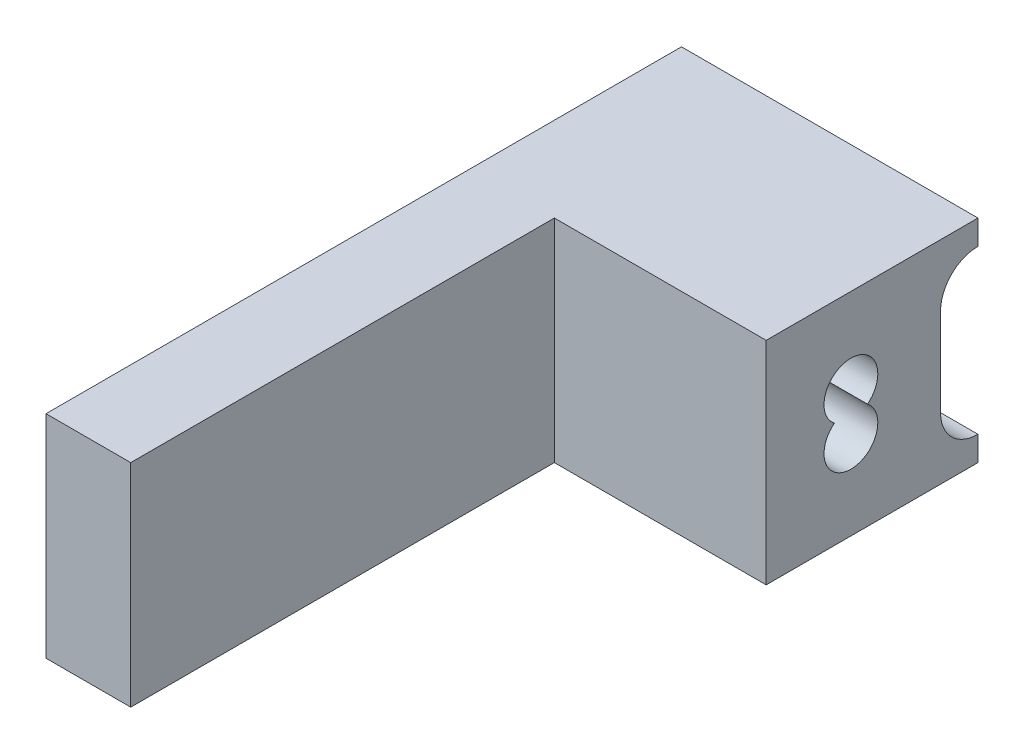
ISO-10303-21;
HEADER;
FILE_DESCRIPTION(('STEP AP214'),'2;1');
FILE_NAME('part.step','',(''),(''),'','','');
FILE_SCHEMA(('AUTOMOTIVE_DESIGN { 1 0 10303 214 1 1 1 1 }'));
ENDSEC;
DATA;
#1=APPLICATION_CONTEXT('core data for automotive mechanical design processes');
#2=APPLICATION_PROTOCOL_DEFINITION('international standard','automotive_design',2000,#1);
#3=PRODUCT_CONTEXT('',#1,'mechanical');
#4=PRODUCT('Part','Part','',(#3));
#5=PRODUCT_RELATED_PRODUCT_CATEGORY('part','',(#4));
#6=PRODUCT_DEFINITION_FORMATION('','',#4);
#7=PRODUCT_DEFINITION_CONTEXT('part definition',#1,'design');
#8=PRODUCT_DEFINITION('design','',#6,#7);
#9=PRODUCT_DEFINITION_SHAPE('','',#8);
#10=(LENGTH_UNIT() NAMED_UNIT(*) SI_UNIT(.MILLI.,.METRE.));
#11=(NAMED_UNIT(*) PLANE_ANGLE_UNIT() SI_UNIT($,.RADIAN.));
#12=(NAMED_UNIT(*) SI_UNIT($,.STERADIAN.) SOLID_ANGLE_UNIT());
#13=UNCERTAINTY_MEASURE_WITH_UNIT(LENGTH_MEASURE(1.E-05),#10,'distance_accuracy_value','');
#14=(GEOMETRIC_REPRESENTATION_CONTEXT(3) GLOBAL_UNCERTAINTY_ASSIGNED_CONTEXT((#13)) GLOBAL_UNIT_ASSIGNED_CONTEXT((#10,
#11,#12)) REPRESENTATION_CONTEXT('',''));
#15=CARTESIAN_POINT('',(0.,0.,0.));
#16=DIRECTION('',(0.,0.,1.));
#17=DIRECTION('',(1.,0.,0.));
#18=AXIS2_PLACEMENT_3D('',#15,#16,#17);
#19=CARTESIAN_POINT('',(-125.,25.,-175.));
#20=DIRECTION('',(0.,0.,1.));
#21=DIRECTION('',(-1.,0.,0.));
#22=AXIS2_PLACEMENT_3D('',#19,#20,#21);
#23=PLANE('',#22);
#24=DIRECTION('',(0.,-1.,0.));
#25=VECTOR('',#24,1.);
#26=CARTESIAN_POINT('',(-125.,25.,-175.));
#27=LINE('',#26,#25);
#28=CARTESIAN_POINT('',(-125.,25.,-175.));
#29=VERTEX_POINT('',#28);
#30=CARTESIAN_POINT('',(-125.,22.1062124204509,-175.));
#31=VERTEX_POINT('',#30);
#32=EDGE_CURVE('E201',#29,#31,#27,.T.);
#33=ORIENTED_EDGE('',*,*,#32,.T.);
#34=DIRECTION('',(1.,0.,0.));
#35=VECTOR('',#34,1.);
#36=CARTESIAN_POINT('',(-160.,22.1062124204509,-175.));
#37=LINE('',#36,#35);
#38=CARTESIAN_POINT('',(-160.,22.1062124204509,-175.));
#39=VERTEX_POINT('',#38);
#40=EDGE_CURVE('E152',#31,#39,#37,.F.);
#41=ORIENTED_EDGE('',*,*,#40,.T.);
#42=DIRECTION('',(0.,-1.,0.));
#43=VECTOR('',#42,1.);
#44=CARTESIAN_POINT('',(-160.,25.,-175.));
#45=LINE('',#44,#43);
#46=CARTESIAN_POINT('',(-160.,25.,-175.));
#47=VERTEX_POINT('',#46);
#48=EDGE_CURVE('E140',#47,#39,#45,.T.);
#49=ORIENTED_EDGE('',*,*,#48,.F.);
#50=DIRECTION('',(1.,0.,0.));
#51=VECTOR('',#50,1.);
#52=CARTESIAN_POINT('',(-125.,25.,-175.));
#53=LINE('',#52,#51);
#54=EDGE_CURVE('E177',#47,#29,#53,.T.);
#55=ORIENTED_EDGE('',*,*,#54,.T.);
#56=EDGE_LOOP('',(#33,#41,#49,#55));
#57=FACE_BOUND('',#56,.T.);
#58=ADVANCED_FACE('F32',(#57),#23,.F.);
#59=CARTESIAN_POINT('',(-150.,25.,-150.));
#60=DIRECTION('',(0.,0.,-1.));
#61=DIRECTION('',(1.,0.,0.));
#62=AXIS2_PLACEMENT_3D('',#59,#60,#61);
#63=PLANE('',#62);
#64=DIRECTION('',(-1.,0.,0.));
#65=VECTOR('',#64,1.);
#66=CARTESIAN_POINT('',(-150.,0.,-150.));
#67=LINE('',#66,#65);
#68=CARTESIAN_POINT('',(-125.,0.,-150.));
#69=VERTEX_POINT('',#68);
#70=CARTESIAN_POINT('',(-150.,0.,-150.));
#71=VERTEX_POINT('',#70);
#72=EDGE_CURVE('E164',#69,#71,#67,.T.);
#73=ORIENTED_EDGE('',*,*,#72,.F.);
#74=DIRECTION('',(0.,-1.,0.));
#75=VECTOR('',#74,1.);
#76=CARTESIAN_POINT('',(-125.,25.,-150.));
#77=LINE('',#76,#75);
#78=CARTESIAN_POINT('',(-125.,25.,-150.));
#79=VERTEX_POINT('',#78);
#80=EDGE_CURVE('E182',#79,#69,#77,.T.);
#81=ORIENTED_EDGE('',*,*,#80,.F.);
#82=DIRECTION('',(-1.,0.,0.));
#83=VECTOR('',#82,1.);
#84=CARTESIAN_POINT('',(-150.,25.,-150.));
#85=LINE('',#84,#83);
#86=CARTESIAN_POINT('',(-150.,25.,-150.));
#87=VERTEX_POINT('',#86);
#88=EDGE_CURVE('E165',#79,#87,#85,.T.);
#89=ORIENTED_EDGE('',*,*,#88,.T.);
#90=DIRECTION('',(0.,-1.,0.));
#91=VECTOR('',#90,1.);
#92=CARTESIAN_POINT('',(-150.,25.,-150.));
#93=LINE('',#92,#91);
#94=EDGE_CURVE('E212',#87,#71,#93,.T.);
#95=ORIENTED_EDGE('',*,*,#94,.T.);
#96=EDGE_LOOP('',(#73,#81,#89,#95));
#97=FACE_BOUND('',#96,.T.);
#98=ADVANCED_FACE('F34',(#97),#63,.F.);
#99=CARTESIAN_POINT('',(-150.,25.,-100.));
#100=DIRECTION('',(-1.,0.,0.));
#101=DIRECTION('',(0.,0.,-1.));
#102=AXIS2_PLACEMENT_3D('',#99,#100,#101);
#103=PLANE('',#102);
#104=DIRECTION('',(0.,0.,1.));
#105=VECTOR('',#104,1.);
#106=CARTESIAN_POINT('',(-150.,0.,-100.));
#107=LINE('',#106,#105);
#108=CARTESIAN_POINT('',(-150.,0.,-100.));
#109=VERTEX_POINT('',#108);
#110=EDGE_CURVE('E185',#71,#109,#107,.T.);
#111=ORIENTED_EDGE('',*,*,#110,.F.);
#112=ORIENTED_EDGE('',*,*,#94,.F.);
#113=DIRECTION('',(0.,0.,1.));
#114=VECTOR('',#113,1.);
#115=CARTESIAN_POINT('',(-150.,25.,-100.));
#116=LINE('',#115,#114);
#117=CARTESIAN_POINT('',(-150.,25.,-100.));
#118=VERTEX_POINT('',#117);
#119=EDGE_CURVE('E168',#87,#118,#116,.T.);
#120=ORIENTED_EDGE('',*,*,#119,.T.);
#121=DIRECTION('',(0.,-1.,0.));
#122=VECTOR('',#121,1.);
#123=CARTESIAN_POINT('',(-150.,25.,-100.));
#124=LINE('',#123,#122);
#125=EDGE_CURVE('E209',#118,#109,#124,.T.);
#126=ORIENTED_EDGE('',*,*,#125,.T.);
#127=EDGE_LOOP('',(#111,#112,#120,#126));
#128=FACE_BOUND('',#127,.T.);
#129=ADVANCED_FACE('F247',(#128),#103,.F.);
#130=CARTESIAN_POINT('',(-160.,25.,-100.));
#131=DIRECTION('',(0.,0.,-1.));
#132=DIRECTION('',(1.,0.,0.));
#133=AXIS2_PLACEMENT_3D('',#130,#131,#132);
#134=PLANE('',#133);
#135=DIRECTION('',(-1.,0.,0.));
#136=VECTOR('',#135,1.);
#137=CARTESIAN_POINT('',(-160.,0.,-100.));
#138=LINE('',#137,#136);
#139=CARTESIAN_POINT('',(-160.,0.,-100.));
#140=VERTEX_POINT('',#139);
#141=EDGE_CURVE('E188',#109,#140,#138,.T.);
#142=ORIENTED_EDGE('',*,*,#141,.F.);
#143=ORIENTED_EDGE('',*,*,#125,.F.);
#144=DIRECTION('',(-1.,0.,0.));
#145=VECTOR('',#144,1.);
#146=CARTESIAN_POINT('',(-160.,25.,-100.));
#147=LINE('',#146,#145);
#148=CARTESIAN_POINT('',(-160.,25.,-100.));
#149=VERTEX_POINT('',#148);
#150=EDGE_CURVE('E172',#118,#149,#147,.T.);
#151=ORIENTED_EDGE('',*,*,#150,.T.);
#152=DIRECTION('',(0.,-1.,0.));
#153=VECTOR('',#152,1.);
#154=CARTESIAN_POINT('',(-160.,25.,-100.));
#155=LINE('',#154,#153);
#156=EDGE_CURVE('E206',#149,#140,#155,.T.);
#157=ORIENTED_EDGE('',*,*,#156,.T.);
#158=EDGE_LOOP('',(#142,#143,#151,#157));
#159=FACE_BOUND('',#158,.T.);
#160=ADVANCED_FACE('F241',(#159),#134,.F.);
#161=CARTESIAN_POINT('',(-160.,25.,-175.));
#162=DIRECTION('',(1.,0.,0.));
#163=DIRECTION('',(0.,0.,1.));
#164=AXIS2_PLACEMENT_3D('',#161,#162,#163);
#165=PLANE('',#164);
#166=ORIENTED_EDGE('',*,*,#48,.T.);
#167=CARTESIAN_POINT('',(-160.,17.6853007015382,-175.));
#168=DIRECTION('',(1.,0.,0.));
#169=DIRECTION('',(0.,0.,-1.));
#170=AXIS2_PLACEMENT_3D('',#167,#168,#169);
#171=CIRCLE('',#170,4.42091171891271);
#172=CARTESIAN_POINT('',(-160.,17.6853007015382,-170.579088281087));
#173=VERTEX_POINT('',#172);
#174=EDGE_CURVE('E122',#39,#173,#171,.T.);
#175=ORIENTED_EDGE('',*,*,#174,.T.);
#176=DIRECTION('',(0.,-1.,0.));
#177=VECTOR('',#176,1.);
#178=CARTESIAN_POINT('',(-160.,17.6853007015382,-170.579088281087));
#179=LINE('',#178,#177);
#180=CARTESIAN_POINT('',(-160.,7.31469929846185,-170.579088281087));
#181=VERTEX_POINT('',#180);
#182=EDGE_CURVE('E129',#173,#181,#179,.T.);
#183=ORIENTED_EDGE('',*,*,#182,.T.);
#184=CARTESIAN_POINT('',(-160.,7.31469929846185,-175.));
#185=DIRECTION('',(1.,0.,0.));
#186=DIRECTION('',(0.,0.,-1.));
#187=AXIS2_PLACEMENT_3D('',#184,#185,#186);
#188=CIRCLE('',#187,4.42091171891271);
#189=CARTESIAN_POINT('',(-160.,2.89378757954914,-175.));
#190=VERTEX_POINT('',#189);
#191=EDGE_CURVE('E126',#181,#190,#188,.T.);
#192=ORIENTED_EDGE('',*,*,#191,.T.);
#193=CARTESIAN_POINT('',(-160.,0.,-175.));
#194=VERTEX_POINT('',#193);
#195=EDGE_CURVE('E204',#190,#194,#45,.T.);
#196=ORIENTED_EDGE('',*,*,#195,.T.);
#197=DIRECTION('',(0.,0.,-1.));
#198=VECTOR('',#197,1.);
#199=CARTESIAN_POINT('',(-160.,0.,-175.));
#200=LINE('',#199,#198);
#201=EDGE_CURVE('E191',#140,#194,#200,.T.);
#202=ORIENTED_EDGE('',*,*,#201,.F.);
#203=ORIENTED_EDGE('',*,*,#156,.F.);
#204=DIRECTION('',(0.,0.,-1.));
#205=VECTOR('',#204,1.);
#206=CARTESIAN_POINT('',(-160.,25.,-175.));
#207=LINE('',#206,#205);
#208=EDGE_CURVE('E175',#149,#47,#207,.T.);
#209=ORIENTED_EDGE('',*,*,#208,.T.);
#210=EDGE_LOOP('',(#166,#175,#183,#192,#196,#202,#203,#209));
#211=FACE_BOUND('',#210,.T.);
#212=CARTESIAN_POINT('',(-160.,15.,-160.000000000001));
#213=DIRECTION('',(1.,0.,0.));
#214=DIRECTION('',(0.,0.,-1.));
#215=AXIS2_PLACEMENT_3D('',#212,#213,#214);
#216=CIRCLE('',#215,3.175);
#217=CARTESIAN_POINT('',(-160.,12.5,-161.957198252606));
#218=VERTEX_POINT('',#217);
#219=CARTESIAN_POINT('',(-160.,12.5,-158.042801747396));
#220=VERTEX_POINT('',#219);
#221=EDGE_CURVE('E157',#218,#220,#216,.T.);
#222=ORIENTED_EDGE('',*,*,#221,.T.);
#223=CARTESIAN_POINT('',(-160.,10.,-160.000000000001));
#224=DIRECTION('',(1.,0.,0.));
#225=DIRECTION('',(0.,0.,1.));
#226=AXIS2_PLACEMENT_3D('',#223,#224,#225);
#227=CIRCLE('',#226,3.175);
#228=EDGE_CURVE('E154',#220,#218,#227,.T.);
#229=ORIENTED_EDGE('',*,*,#228,.T.);
#230=EDGE_LOOP('',(#222,#229));
#231=FACE_BOUND('',#230,.T.);
#232=ADVANCED_FACE('F136',(#211,#231),#165,.F.);
#233=ORIENTED_EDGE('',*,*,#195,.F.);
#234=DIRECTION('',(1.,0.,0.));
#235=VECTOR('',#234,1.);
#236=CARTESIAN_POINT('',(-160.,2.89378757954914,-175.));
#237=LINE('',#236,#235);
#238=CARTESIAN_POINT('',(-125.,2.89378757954914,-175.));
#239=VERTEX_POINT('',#238);
#240=EDGE_CURVE('E148',#190,#239,#237,.T.);
#241=ORIENTED_EDGE('',*,*,#240,.T.);
#242=CARTESIAN_POINT('',(-125.,0.,-175.));
#243=VERTEX_POINT('',#242);
#244=EDGE_CURVE('E200',#239,#243,#27,.T.);
#245=ORIENTED_EDGE('',*,*,#244,.T.);
#246=DIRECTION('',(1.,0.,0.));
#247=VECTOR('',#246,1.);
#248=CARTESIAN_POINT('',(-125.,0.,-175.));
#249=LINE('',#248,#247);
#250=EDGE_CURVE('E194',#194,#243,#249,.T.);
#251=ORIENTED_EDGE('',*,*,#250,.F.);
#252=EDGE_LOOP('',(#233,#241,#245,#251));
#253=FACE_BOUND('',#252,.T.);
#254=ADVANCED_FACE('F227',(#253),#23,.F.);
#255=CARTESIAN_POINT('',(-125.,25.,-150.));
#256=DIRECTION('',(-1.,0.,0.));
#257=DIRECTION('',(0.,0.,-1.));
#258=AXIS2_PLACEMENT_3D('',#255,#256,#257);
#259=PLANE('',#258);
#260=CARTESIAN_POINT('',(-125.,15.,-160.000000000001));
#261=DIRECTION('',(1.,0.,0.));
#262=DIRECTION('',(0.,0.,-1.));
#263=AXIS2_PLACEMENT_3D('',#260,#261,#262);
#264=CIRCLE('',#263,3.175);
#265=CARTESIAN_POINT('',(-125.,12.5,-161.957198252606));
#266=VERTEX_POINT('',#265);
#267=CARTESIAN_POINT('',(-125.,12.5,-158.042801747396));
#268=VERTEX_POINT('',#267);
#269=EDGE_CURVE('E161',#266,#268,#264,.T.);
#270=ORIENTED_EDGE('',*,*,#269,.F.);
#271=CARTESIAN_POINT('',(-125.,10.,-160.000000000001));
#272=DIRECTION('',(1.,0.,0.));
#273=DIRECTION('',(0.,0.,1.));
#274=AXIS2_PLACEMENT_3D('',#271,#272,#273);
#275=CIRCLE('',#274,3.175);
#276=EDGE_CURVE('E55',#268,#266,#275,.T.);
#277=ORIENTED_EDGE('',*,*,#276,.F.);
#278=EDGE_LOOP('',(#270,#277));
#279=FACE_BOUND('',#278,.T.);
#280=DIRECTION('',(0.,-1.,0.));
#281=VECTOR('',#280,1.);
#282=CARTESIAN_POINT('',(-125.,17.6853007015382,-170.579088281087));
#283=LINE('',#282,#281);
#284=CARTESIAN_POINT('',(-125.,17.6853007015382,-170.579088281087));
#285=VERTEX_POINT('',#284);
#286=CARTESIAN_POINT('',(-125.,7.31469929846185,-170.579088281087));
#287=VERTEX_POINT('',#286);
#288=EDGE_CURVE('E143',#285,#287,#283,.T.);
#289=ORIENTED_EDGE('',*,*,#288,.F.);
#290=CARTESIAN_POINT('',(-125.,17.6853007015382,-175.));
#291=DIRECTION('',(-1.,0.,0.));
#292=DIRECTION('',(0.,0.,1.));
#293=AXIS2_PLACEMENT_3D('',#290,#291,#292);
#294=CIRCLE('',#293,4.42091171891271);
#295=EDGE_CURVE('E11',#285,#31,#294,.T.);
#296=ORIENTED_EDGE('',*,*,#295,.T.);
#297=ORIENTED_EDGE('',*,*,#32,.F.);
#298=DIRECTION('',(0.,0.,1.));
#299=VECTOR('',#298,1.);
#300=CARTESIAN_POINT('',(-125.,25.,-150.));
#301=LINE('',#300,#299);
#302=EDGE_CURVE('E180',#29,#79,#301,.T.);
#303=ORIENTED_EDGE('',*,*,#302,.T.);
#304=ORIENTED_EDGE('',*,*,#80,.T.);
#305=DIRECTION('',(0.,0.,1.));
#306=VECTOR('',#305,1.);
#307=CARTESIAN_POINT('',(-125.,0.,-150.));
#308=LINE('',#307,#306);
#309=EDGE_CURVE('E169',#243,#69,#308,.T.);
#310=ORIENTED_EDGE('',*,*,#309,.F.);
#311=ORIENTED_EDGE('',*,*,#244,.F.);
#312=CARTESIAN_POINT('',(-125.,7.31469929846185,-175.));
#313=DIRECTION('',(1.,0.,0.));
#314=DIRECTION('',(0.,0.,-1.));
#315=AXIS2_PLACEMENT_3D('',#312,#313,#314);
#316=CIRCLE('',#315,4.42091171891271);
#317=EDGE_CURVE('E141',#287,#239,#316,.T.);
#318=ORIENTED_EDGE('',*,*,#317,.F.);
#319=EDGE_LOOP('',(#289,#296,#297,#303,#304,#310,#311,#318));
#320=FACE_BOUND('',#319,.T.);
#321=ADVANCED_FACE('F223',(#279,#320),#259,.F.);
#322=CARTESIAN_POINT('',(0.,25.,0.));
#323=DIRECTION('',(0.,-1.,0.));
#324=DIRECTION('',(0.,0.,-1.));
#325=AXIS2_PLACEMENT_3D('',#322,#323,#324);
#326=PLANE('',#325);
#327=ORIENTED_EDGE('',*,*,#88,.F.);
#328=ORIENTED_EDGE('',*,*,#302,.F.);
#329=ORIENTED_EDGE('',*,*,#54,.F.);
#330=ORIENTED_EDGE('',*,*,#208,.F.);
#331=ORIENTED_EDGE('',*,*,#150,.F.);
#332=ORIENTED_EDGE('',*,*,#119,.F.);
#333=EDGE_LOOP('',(#327,#328,#329,#330,#331,#332));
#334=FACE_BOUND('',#333,.T.);
#335=ADVANCED_FACE('F226',(#334),#326,.F.);
#336=CARTESIAN_POINT('',(0.,0.,0.));
#337=DIRECTION('',(0.,-1.,0.));
#338=DIRECTION('',(0.,0.,-1.));
#339=AXIS2_PLACEMENT_3D('',#336,#337,#338);
#340=PLANE('',#339);
#341=ORIENTED_EDGE('',*,*,#72,.T.);
#342=ORIENTED_EDGE('',*,*,#110,.T.);
#343=ORIENTED_EDGE('',*,*,#141,.T.);
#344=ORIENTED_EDGE('',*,*,#201,.T.);
#345=ORIENTED_EDGE('',*,*,#250,.T.);
#346=ORIENTED_EDGE('',*,*,#309,.T.);
#347=EDGE_LOOP('',(#341,#342,#343,#344,#345,#346));
#348=FACE_BOUND('',#347,.T.);
#349=ADVANCED_FACE('F243',(#348),#340,.T.);
#350=CARTESIAN_POINT('',(153.980256121069,15.,-160.));
#351=DIRECTION('',(-1.,0.,0.));
#352=DIRECTION('',(0.,0.,-1.));
#353=AXIS2_PLACEMENT_3D('',#350,#351,#352);
#354=CYLINDRICAL_SURFACE('',#353,3.175);
#355=ORIENTED_EDGE('',*,*,#269,.T.);
#356=DIRECTION('',(1.,0.,0.));
#357=VECTOR('',#356,1.);
#358=CARTESIAN_POINT('',(-142.5,12.5,-158.042801747396));
#359=LINE('',#358,#357);
#360=EDGE_CURVE('E40',#268,#220,#359,.F.);
#361=ORIENTED_EDGE('',*,*,#360,.T.);
#362=ORIENTED_EDGE('',*,*,#221,.F.);
#363=DIRECTION('',(1.,0.,0.));
#364=VECTOR('',#363,1.);
#365=CARTESIAN_POINT('',(-142.5,12.5,-161.957198252606));
#366=LINE('',#365,#364);
#367=EDGE_CURVE('E215',#218,#266,#366,.T.);
#368=ORIENTED_EDGE('',*,*,#367,.T.);
#369=EDGE_LOOP('',(#355,#361,#362,#368));
#370=FACE_BOUND('',#369,.T.);
#371=ADVANCED_FACE('F219',(#370),#354,.F.);
#372=CARTESIAN_POINT('',(-160.,10.,-160.000000000001));
#373=DIRECTION('',(1.,0.,0.));
#374=DIRECTION('',(0.,0.,-1.));
#375=AXIS2_PLACEMENT_3D('',#372,#373,#374);
#376=CYLINDRICAL_SURFACE('',#375,3.175);
#377=ORIENTED_EDGE('',*,*,#276,.T.);
#378=ORIENTED_EDGE('',*,*,#367,.F.);
#379=ORIENTED_EDGE('',*,*,#228,.F.);
#380=ORIENTED_EDGE('',*,*,#360,.F.);
#381=EDGE_LOOP('',(#377,#378,#379,#380));
#382=FACE_BOUND('',#381,.T.);
#383=ADVANCED_FACE('F221',(#382),#376,.F.);
#384=CARTESIAN_POINT('',(-160.,17.6853007015382,-175.));
#385=DIRECTION('',(1.,0.,0.));
#386=DIRECTION('',(0.,0.,-1.));
#387=AXIS2_PLACEMENT_3D('',#384,#385,#386);
#388=CYLINDRICAL_SURFACE('',#387,4.42091171891271);
#389=ORIENTED_EDGE('',*,*,#295,.F.);
#390=DIRECTION('',(1.,0.,0.));
#391=VECTOR('',#390,1.);
#392=CARTESIAN_POINT('',(-160.,17.6853007015382,-170.579088281087));
#393=LINE('',#392,#391);
#394=EDGE_CURVE('E47',#173,#285,#393,.T.);
#395=ORIENTED_EDGE('',*,*,#394,.F.);
#396=ORIENTED_EDGE('',*,*,#174,.F.);
#397=ORIENTED_EDGE('',*,*,#40,.F.);
#398=EDGE_LOOP('',(#389,#395,#396,#397));
#399=FACE_BOUND('',#398,.T.);
#400=ADVANCED_FACE('F120',(#399),#388,.F.);
#401=CARTESIAN_POINT('',(-160.,7.31469929846185,-175.));
#402=DIRECTION('',(1.,0.,0.));
#403=DIRECTION('',(0.,0.,-1.));
#404=AXIS2_PLACEMENT_3D('',#401,#402,#403);
#405=CYLINDRICAL_SURFACE('',#404,4.42091171891271);
#406=ORIENTED_EDGE('',*,*,#191,.F.);
#407=DIRECTION('',(1.,0.,0.));
#408=VECTOR('',#407,1.);
#409=CARTESIAN_POINT('',(-160.,7.31469929846185,-170.579088281087));
#410=LINE('',#409,#408);
#411=EDGE_CURVE('E125',#181,#287,#410,.T.);
#412=ORIENTED_EDGE('',*,*,#411,.T.);
#413=ORIENTED_EDGE('',*,*,#317,.T.);
#414=ORIENTED_EDGE('',*,*,#240,.F.);
#415=EDGE_LOOP('',(#406,#412,#413,#414));
#416=FACE_BOUND('',#415,.T.);
#417=ADVANCED_FACE('F234',(#416),#405,.F.);
#418=CARTESIAN_POINT('',(-160.,17.6853007015382,-170.579088281087));
#419=DIRECTION('',(0.,0.,1.));
#420=DIRECTION('',(1.,0.,0.));
#421=AXIS2_PLACEMENT_3D('',#418,#419,#420);
#422=PLANE('',#421);
#423=ORIENTED_EDGE('',*,*,#288,.T.);
#424=ORIENTED_EDGE('',*,*,#411,.F.);
#425=ORIENTED_EDGE('',*,*,#182,.F.);
#426=ORIENTED_EDGE('',*,*,#394,.T.);
#427=EDGE_LOOP('',(#423,#424,#425,#426));
#428=FACE_BOUND('',#427,.T.);
#429=ADVANCED_FACE('F130',(#428),#422,.F.);
#430=CLOSED_SHELL('',(#58,#98,#129,#160,#232,#254,#321,#335,#349,#371,#383,#400,#417,#429));
#431=MANIFOLD_SOLID_BREP('B2',#430);
#432=ADVANCED_BREP_SHAPE_REPRESENTATION('',(#18,#431),#14);
#433=SHAPE_DEFINITION_REPRESENTATION(#9,#432);
ENDSEC;
END-ISO-10303-21;
